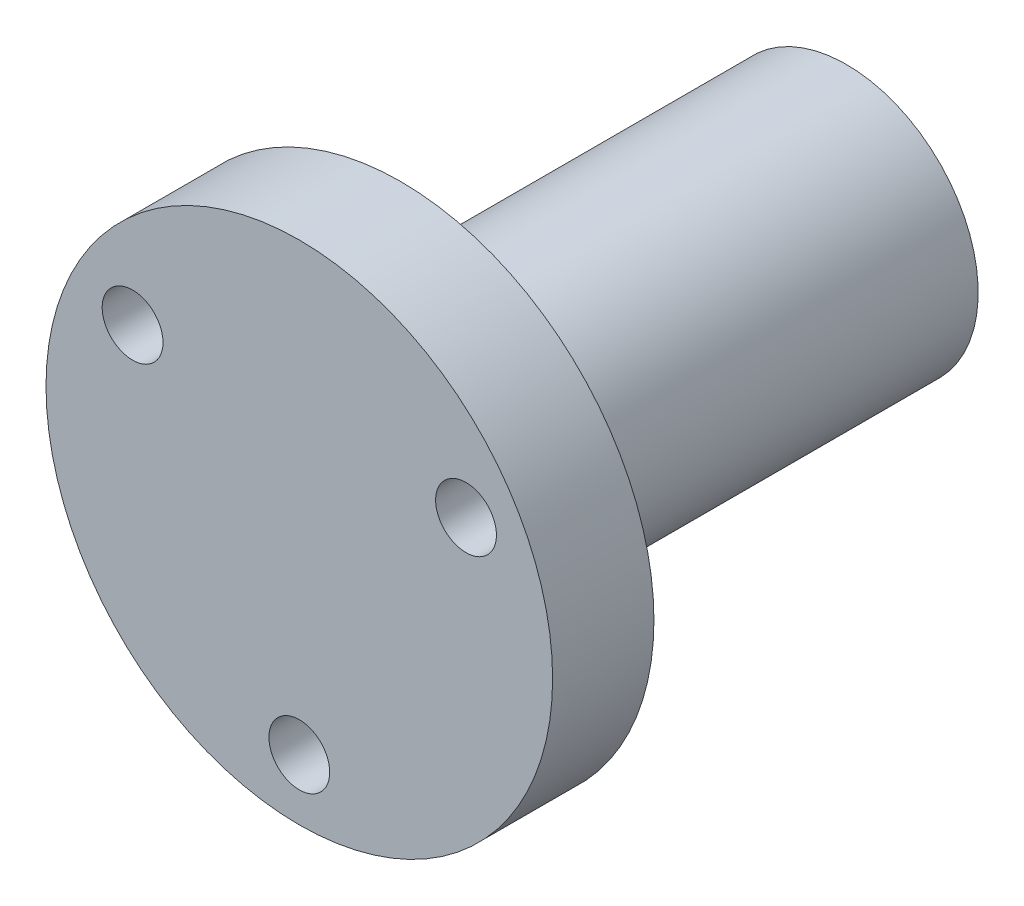
ISO-10303-21;
HEADER;
FILE_DESCRIPTION(('STEP AP214'),'2;1');
FILE_NAME('part.step','',(''),(''),'','','');
FILE_SCHEMA(('AUTOMOTIVE_DESIGN { 1 0 10303 214 1 1 1 1 }'));
ENDSEC;
DATA;
#1=APPLICATION_CONTEXT('core data for automotive mechanical design processes');
#2=APPLICATION_PROTOCOL_DEFINITION('international standard','automotive_design',2000,#1);
#3=PRODUCT_CONTEXT('',#1,'mechanical');
#4=PRODUCT('Part','Part','',(#3));
#5=PRODUCT_RELATED_PRODUCT_CATEGORY('part','',(#4));
#6=PRODUCT_DEFINITION_FORMATION('','',#4);
#7=PRODUCT_DEFINITION_CONTEXT('part definition',#1,'design');
#8=PRODUCT_DEFINITION('design','',#6,#7);
#9=PRODUCT_DEFINITION_SHAPE('','',#8);
#10=(LENGTH_UNIT() NAMED_UNIT(*) SI_UNIT(.MILLI.,.METRE.));
#11=(NAMED_UNIT(*) PLANE_ANGLE_UNIT() SI_UNIT($,.RADIAN.));
#12=(NAMED_UNIT(*) SI_UNIT($,.STERADIAN.) SOLID_ANGLE_UNIT());
#13=UNCERTAINTY_MEASURE_WITH_UNIT(LENGTH_MEASURE(1.E-05),#10,'distance_accuracy_value','');
#14=(GEOMETRIC_REPRESENTATION_CONTEXT(3) GLOBAL_UNCERTAINTY_ASSIGNED_CONTEXT((#13)) GLOBAL_UNIT_ASSIGNED_CONTEXT((#10,
#11,#12)) REPRESENTATION_CONTEXT('',''));
#15=CARTESIAN_POINT('',(0.,0.,0.));
#16=DIRECTION('',(0.,0.,1.));
#17=DIRECTION('',(1.,0.,0.));
#18=AXIS2_PLACEMENT_3D('',#15,#16,#17);
#19=CARTESIAN_POINT('',(0.,0.,-5.));
#20=DIRECTION('',(0.,0.,1.));
#21=DIRECTION('',(1.,0.,0.));
#22=AXIS2_PLACEMENT_3D('',#19,#20,#21);
#23=CYLINDRICAL_SURFACE('',#22,12.5);
#24=CARTESIAN_POINT('',(0.,0.,-5.));
#25=DIRECTION('',(0.,0.,1.));
#26=DIRECTION('',(1.,0.,0.));
#27=AXIS2_PLACEMENT_3D('',#24,#25,#26);
#28=CIRCLE('',#27,12.5);
#29=CARTESIAN_POINT('',(12.5,0.,-5.));
#30=VERTEX_POINT('',#29);
#31=EDGE_CURVE('E44',#30,#30,#28,.T.);
#32=ORIENTED_EDGE('',*,*,#31,.T.);
#33=EDGE_LOOP('',(#32));
#34=FACE_BOUND('',#33,.T.);
#35=CARTESIAN_POINT('',(0.,0.,0.));
#36=DIRECTION('',(0.,0.,1.));
#37=DIRECTION('',(1.,0.,0.));
#38=AXIS2_PLACEMENT_3D('',#35,#36,#37);
#39=CIRCLE('',#38,12.5);
#40=CARTESIAN_POINT('',(12.5,0.,0.));
#41=VERTEX_POINT('',#40);
#42=EDGE_CURVE('E39',#41,#41,#39,.T.);
#43=ORIENTED_EDGE('',*,*,#42,.F.);
#44=EDGE_LOOP('',(#43));
#45=FACE_BOUND('',#44,.T.);
#46=ADVANCED_FACE('F36',(#34,#45),#23,.T.);
#47=CARTESIAN_POINT('',(0.,0.,-5.));
#48=DIRECTION('',(0.,0.,1.));
#49=DIRECTION('',(1.,0.,0.));
#50=AXIS2_PLACEMENT_3D('',#47,#48,#49);
#51=PLANE('',#50);
#52=CARTESIAN_POINT('',(-8.22724133595216,4.75000000000001,-5.));
#53=DIRECTION('',(0.,0.,1.));
#54=DIRECTION('',(1.,0.,0.));
#55=AXIS2_PLACEMENT_3D('',#52,#53,#54);
#56=CIRCLE('',#55,1.5);
#57=CARTESIAN_POINT('',(-6.72724133595217,4.75000000000001,-5.));
#58=VERTEX_POINT('',#57);
#59=EDGE_CURVE('E78',#58,#58,#56,.F.);
#60=ORIENTED_EDGE('',*,*,#59,.F.);
#61=EDGE_LOOP('',(#60));
#62=FACE_BOUND('',#61,.T.);
#63=CARTESIAN_POINT('',(8.22724133595281,4.7499999999989,-5.));
#64=DIRECTION('',(0.,0.,1.));
#65=DIRECTION('',(1.,0.,0.));
#66=AXIS2_PLACEMENT_3D('',#63,#64,#65);
#67=CIRCLE('',#66,1.5);
#68=CARTESIAN_POINT('',(9.72724133595281,4.7499999999989,-5.));
#69=VERTEX_POINT('',#68);
#70=EDGE_CURVE('E140',#69,#69,#67,.F.);
#71=ORIENTED_EDGE('',*,*,#70,.F.);
#72=EDGE_LOOP('',(#71));
#73=FACE_BOUND('',#72,.T.);
#74=CARTESIAN_POINT('',(-2.53879491214637E-12,-9.5,-5.));
#75=DIRECTION('',(0.,0.,1.));
#76=DIRECTION('',(1.,0.,0.));
#77=AXIS2_PLACEMENT_3D('',#74,#75,#76);
#78=CIRCLE('',#77,1.5);
#79=CARTESIAN_POINT('',(1.49999999999746,-9.5,-5.));
#80=VERTEX_POINT('',#79);
#81=EDGE_CURVE('E147',#80,#80,#78,.F.);
#82=ORIENTED_EDGE('',*,*,#81,.F.);
#83=EDGE_LOOP('',(#82));
#84=FACE_BOUND('',#83,.T.);
#85=CARTESIAN_POINT('',(0.,0.,-5.));
#86=DIRECTION('',(0.,0.,-1.));
#87=DIRECTION('',(-1.,0.,0.));
#88=AXIS2_PLACEMENT_3D('',#85,#86,#87);
#89=CIRCLE('',#88,6.5);
#90=CARTESIAN_POINT('',(-6.5,0.,-5.));
#91=VERTEX_POINT('',#90);
#92=EDGE_CURVE('E11',#91,#91,#89,.T.);
#93=ORIENTED_EDGE('',*,*,#92,.F.);
#94=EDGE_LOOP('',(#93));
#95=FACE_BOUND('',#94,.T.);
#96=ORIENTED_EDGE('',*,*,#31,.F.);
#97=EDGE_LOOP('',(#96));
#98=FACE_BOUND('',#97,.T.);
#99=ADVANCED_FACE('F98',(#62,#73,#84,#95,#98),#51,.F.);
#100=CARTESIAN_POINT('',(0.,0.,0.));
#101=DIRECTION('',(0.,0.,1.));
#102=DIRECTION('',(1.,0.,0.));
#103=AXIS2_PLACEMENT_3D('',#100,#101,#102);
#104=PLANE('',#103);
#105=CARTESIAN_POINT('',(-8.22724133595216,4.75000000000001,0.));
#106=DIRECTION('',(0.,0.,1.));
#107=DIRECTION('',(1.,0.,0.));
#108=AXIS2_PLACEMENT_3D('',#105,#106,#107);
#109=CIRCLE('',#108,1.5);
#110=CARTESIAN_POINT('',(-6.72724133595217,4.75000000000001,0.));
#111=VERTEX_POINT('',#110);
#112=EDGE_CURVE('E81',#111,#111,#109,.T.);
#113=ORIENTED_EDGE('',*,*,#112,.F.);
#114=EDGE_LOOP('',(#113));
#115=FACE_BOUND('',#114,.T.);
#116=CARTESIAN_POINT('',(8.22724133595281,4.7499999999989,0.));
#117=DIRECTION('',(0.,0.,1.));
#118=DIRECTION('',(1.,0.,0.));
#119=AXIS2_PLACEMENT_3D('',#116,#117,#118);
#120=CIRCLE('',#119,1.5);
#121=CARTESIAN_POINT('',(9.72724133595281,4.7499999999989,0.));
#122=VERTEX_POINT('',#121);
#123=EDGE_CURVE('E143',#122,#122,#120,.T.);
#124=ORIENTED_EDGE('',*,*,#123,.F.);
#125=EDGE_LOOP('',(#124));
#126=FACE_BOUND('',#125,.T.);
#127=CARTESIAN_POINT('',(-2.53879491214637E-12,-9.5,0.));
#128=DIRECTION('',(0.,0.,1.));
#129=DIRECTION('',(1.,0.,0.));
#130=AXIS2_PLACEMENT_3D('',#127,#128,#129);
#131=CIRCLE('',#130,1.5);
#132=CARTESIAN_POINT('',(1.49999999999746,-9.5,0.));
#133=VERTEX_POINT('',#132);
#134=EDGE_CURVE('E149',#133,#133,#131,.T.);
#135=ORIENTED_EDGE('',*,*,#134,.F.);
#136=EDGE_LOOP('',(#135));
#137=FACE_BOUND('',#136,.T.);
#138=ORIENTED_EDGE('',*,*,#42,.T.);
#139=EDGE_LOOP('',(#138));
#140=FACE_BOUND('',#139,.T.);
#141=ADVANCED_FACE('F95',(#115,#126,#137,#140),#104,.T.);
#142=CARTESIAN_POINT('',(0.,0.,-27.));
#143=DIRECTION('',(0.,0.,1.));
#144=DIRECTION('',(1.,0.,0.));
#145=AXIS2_PLACEMENT_3D('',#142,#143,#144);
#146=CYLINDRICAL_SURFACE('',#145,6.5);
#147=CARTESIAN_POINT('',(0.,0.,-27.));
#148=DIRECTION('',(0.,0.,-1.));
#149=DIRECTION('',(-1.,0.,0.));
#150=AXIS2_PLACEMENT_3D('',#147,#148,#149);
#151=CIRCLE('',#150,6.5);
#152=CARTESIAN_POINT('',(-6.5,0.,-27.));
#153=VERTEX_POINT('',#152);
#154=EDGE_CURVE('E68',#153,#153,#151,.T.);
#155=ORIENTED_EDGE('',*,*,#154,.F.);
#156=EDGE_LOOP('',(#155));
#157=FACE_BOUND('',#156,.T.);
#158=ORIENTED_EDGE('',*,*,#92,.T.);
#159=EDGE_LOOP('',(#158));
#160=FACE_BOUND('',#159,.T.);
#161=ADVANCED_FACE('F106',(#157,#160),#146,.T.);
#162=CARTESIAN_POINT('',(0.,0.,-27.));
#163=DIRECTION('',(0.,0.,-1.));
#164=DIRECTION('',(-1.,0.,0.));
#165=AXIS2_PLACEMENT_3D('',#162,#163,#164);
#166=PLANE('',#165);
#167=CARTESIAN_POINT('',(0.,0.,-27.));
#168=DIRECTION('',(0.,0.,-1.));
#169=DIRECTION('',(-1.,0.,0.));
#170=AXIS2_PLACEMENT_3D('',#167,#168,#169);
#171=CIRCLE('',#170,2.9);
#172=CARTESIAN_POINT('',(-1.76635217326557,-2.3,-27.));
#173=VERTEX_POINT('',#172);
#174=CARTESIAN_POINT('',(1.76635217326557,-2.3,-27.));
#175=VERTEX_POINT('',#174);
#176=EDGE_CURVE('E52',#173,#175,#171,.T.);
#177=ORIENTED_EDGE('',*,*,#176,.F.);
#178=DIRECTION('',(-1.,0.,0.));
#179=VECTOR('',#178,1.);
#180=CARTESIAN_POINT('',(1.76635217326557,-2.3,-27.));
#181=LINE('',#180,#179);
#182=EDGE_CURVE('E72',#175,#173,#181,.T.);
#183=ORIENTED_EDGE('',*,*,#182,.F.);
#184=EDGE_LOOP('',(#177,#183));
#185=FACE_BOUND('',#184,.T.);
#186=ORIENTED_EDGE('',*,*,#154,.T.);
#187=EDGE_LOOP('',(#186));
#188=FACE_BOUND('',#187,.T.);
#189=ADVANCED_FACE('F76',(#185,#188),#166,.T.);
#190=CARTESIAN_POINT('',(0.,0.,-5.));
#191=DIRECTION('',(0.,0.,-1.));
#192=DIRECTION('',(-1.,0.,0.));
#193=AXIS2_PLACEMENT_3D('',#190,#191,#192);
#194=CYLINDRICAL_SURFACE('',#193,2.9);
#195=ORIENTED_EDGE('',*,*,#176,.T.);
#196=DIRECTION('',(0.,0.,-1.));
#197=VECTOR('',#196,1.);
#198=CARTESIAN_POINT('',(1.76635217326557,-2.3,-5.));
#199=LINE('',#198,#197);
#200=CARTESIAN_POINT('',(1.76635217326557,-2.3,-5.));
#201=VERTEX_POINT('',#200);
#202=EDGE_CURVE('E69',#201,#175,#199,.T.);
#203=ORIENTED_EDGE('',*,*,#202,.F.);
#204=CARTESIAN_POINT('',(0.,0.,-5.));
#205=DIRECTION('',(0.,0.,-1.));
#206=DIRECTION('',(-1.,0.,0.));
#207=AXIS2_PLACEMENT_3D('',#204,#205,#206);
#208=CIRCLE('',#207,2.9);
#209=CARTESIAN_POINT('',(-1.76635217326557,-2.3,-5.));
#210=VERTEX_POINT('',#209);
#211=EDGE_CURVE('E66',#210,#201,#208,.T.);
#212=ORIENTED_EDGE('',*,*,#211,.F.);
#213=DIRECTION('',(0.,0.,-1.));
#214=VECTOR('',#213,1.);
#215=CARTESIAN_POINT('',(-1.76635217326557,-2.3,-5.));
#216=LINE('',#215,#214);
#217=EDGE_CURVE('E60',#210,#173,#216,.T.);
#218=ORIENTED_EDGE('',*,*,#217,.T.);
#219=EDGE_LOOP('',(#195,#203,#212,#218));
#220=FACE_BOUND('',#219,.T.);
#221=ADVANCED_FACE('F64',(#220),#194,.F.);
#222=CARTESIAN_POINT('',(1.76635217326557,-2.3,-5.));
#223=DIRECTION('',(0.,-1.,0.));
#224=DIRECTION('',(0.,0.,-1.));
#225=AXIS2_PLACEMENT_3D('',#222,#223,#224);
#226=PLANE('',#225);
#227=ORIENTED_EDGE('',*,*,#182,.T.);
#228=ORIENTED_EDGE('',*,*,#217,.F.);
#229=DIRECTION('',(-1.,0.,0.));
#230=VECTOR('',#229,1.);
#231=CARTESIAN_POINT('',(1.76635217326557,-2.3,-5.));
#232=LINE('',#231,#230);
#233=EDGE_CURVE('E84',#201,#210,#232,.T.);
#234=ORIENTED_EDGE('',*,*,#233,.F.);
#235=ORIENTED_EDGE('',*,*,#202,.T.);
#236=EDGE_LOOP('',(#227,#228,#234,#235));
#237=FACE_BOUND('',#236,.T.);
#238=ADVANCED_FACE('F73',(#237),#226,.F.);
#239=CARTESIAN_POINT('',(0.,0.,-5.));
#240=DIRECTION('',(0.,0.,-1.));
#241=DIRECTION('',(-1.,0.,0.));
#242=AXIS2_PLACEMENT_3D('',#239,#240,#241);
#243=PLANE('',#242);
#244=ORIENTED_EDGE('',*,*,#211,.T.);
#245=ORIENTED_EDGE('',*,*,#233,.T.);
#246=EDGE_LOOP('',(#244,#245));
#247=FACE_BOUND('',#246,.T.);
#248=ADVANCED_FACE('F120',(#247),#243,.T.);
#249=CARTESIAN_POINT('',(-2.53879491214637E-12,-9.5,-27.001));
#250=DIRECTION('',(0.,0.,1.));
#251=DIRECTION('',(1.,0.,0.));
#252=AXIS2_PLACEMENT_3D('',#249,#250,#251);
#253=CYLINDRICAL_SURFACE('',#252,1.5);
#254=ORIENTED_EDGE('',*,*,#134,.T.);
#255=EDGE_LOOP('',(#254));
#256=FACE_BOUND('',#255,.T.);
#257=ORIENTED_EDGE('',*,*,#81,.T.);
#258=EDGE_LOOP('',(#257));
#259=FACE_BOUND('',#258,.T.);
#260=ADVANCED_FACE('F123',(#256,#259),#253,.F.);
#261=CARTESIAN_POINT('',(8.22724133595281,4.7499999999989,-27.001));
#262=DIRECTION('',(0.,0.,1.));
#263=DIRECTION('',(1.,0.,0.));
#264=AXIS2_PLACEMENT_3D('',#261,#262,#263);
#265=CYLINDRICAL_SURFACE('',#264,1.5);
#266=ORIENTED_EDGE('',*,*,#123,.T.);
#267=EDGE_LOOP('',(#266));
#268=FACE_BOUND('',#267,.T.);
#269=ORIENTED_EDGE('',*,*,#70,.T.);
#270=EDGE_LOOP('',(#269));
#271=FACE_BOUND('',#270,.T.);
#272=ADVANCED_FACE('F127',(#268,#271),#265,.F.);
#273=CARTESIAN_POINT('',(-8.22724133595216,4.75000000000001,-27.001));
#274=DIRECTION('',(0.,0.,1.));
#275=DIRECTION('',(1.,0.,0.));
#276=AXIS2_PLACEMENT_3D('',#273,#274,#275);
#277=CYLINDRICAL_SURFACE('',#276,1.5);
#278=ORIENTED_EDGE('',*,*,#112,.T.);
#279=EDGE_LOOP('',(#278));
#280=FACE_BOUND('',#279,.T.);
#281=ORIENTED_EDGE('',*,*,#59,.T.);
#282=EDGE_LOOP('',(#281));
#283=FACE_BOUND('',#282,.T.);
#284=ADVANCED_FACE('F131',(#280,#283),#277,.F.);
#285=CLOSED_SHELL('',(#46,#99,#141,#161,#189,#221,#238,#248,#260,#272,#284));
#286=MANIFOLD_SOLID_BREP('B2',#285);
#287=ADVANCED_BREP_SHAPE_REPRESENTATION('',(#18,#286),#14);
#288=SHAPE_DEFINITION_REPRESENTATION(#9,#287);
ENDSEC;
END-ISO-10303-21;
